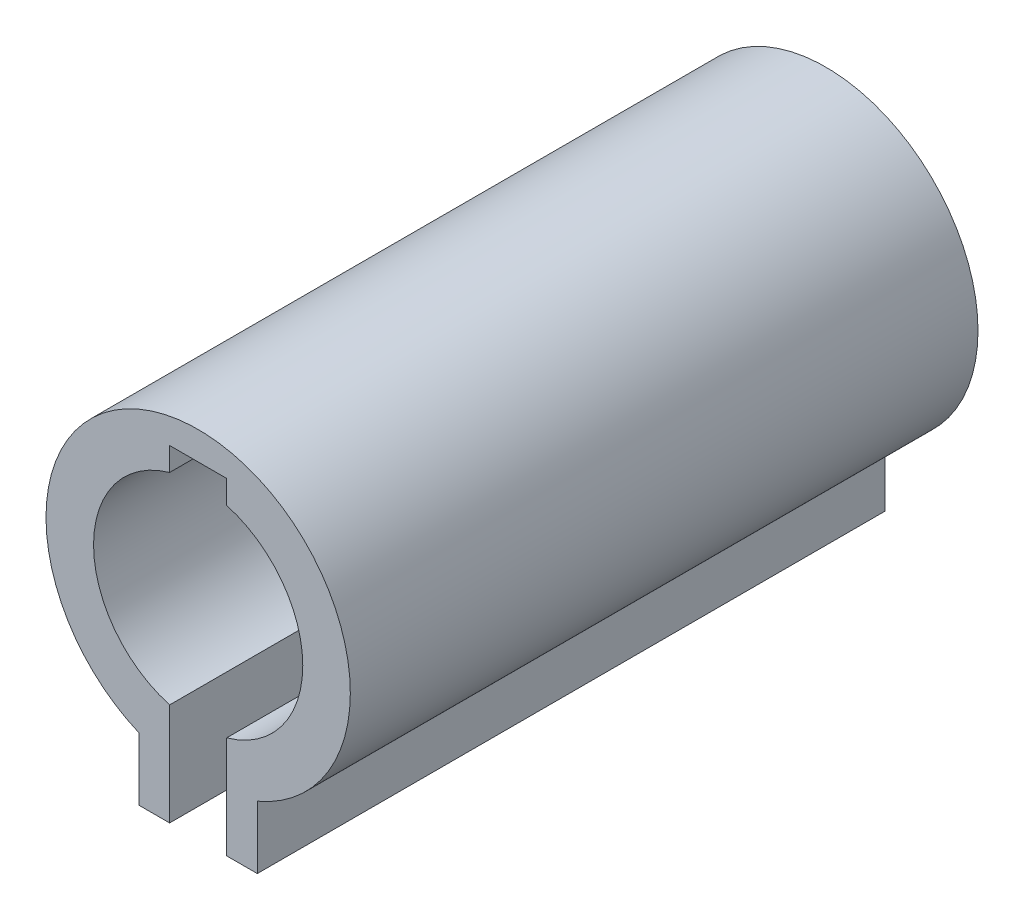
ISO-10303-21;
HEADER;
FILE_DESCRIPTION(('STEP AP214'),'2;1');
FILE_NAME('part.step','',(''),(''),'','','');
FILE_SCHEMA(('AUTOMOTIVE_DESIGN { 1 0 10303 214 1 1 1 1 }'));
ENDSEC;
DATA;
#1=APPLICATION_CONTEXT('core data for automotive mechanical design processes');
#2=APPLICATION_PROTOCOL_DEFINITION('international standard','automotive_design',2000,#1);
#3=PRODUCT_CONTEXT('',#1,'mechanical');
#4=PRODUCT('Part','Part','',(#3));
#5=PRODUCT_RELATED_PRODUCT_CATEGORY('part','',(#4));
#6=PRODUCT_DEFINITION_FORMATION('','',#4);
#7=PRODUCT_DEFINITION_CONTEXT('part definition',#1,'design');
#8=PRODUCT_DEFINITION('design','',#6,#7);
#9=PRODUCT_DEFINITION_SHAPE('','',#8);
#10=(LENGTH_UNIT() NAMED_UNIT(*) SI_UNIT(.MILLI.,.METRE.));
#11=(NAMED_UNIT(*) PLANE_ANGLE_UNIT() SI_UNIT($,.RADIAN.));
#12=(NAMED_UNIT(*) SI_UNIT($,.STERADIAN.) SOLID_ANGLE_UNIT());
#13=UNCERTAINTY_MEASURE_WITH_UNIT(LENGTH_MEASURE(1.E-05),#10,'distance_accuracy_value','');
#14=(GEOMETRIC_REPRESENTATION_CONTEXT(3) GLOBAL_UNCERTAINTY_ASSIGNED_CONTEXT((#13)) GLOBAL_UNIT_ASSIGNED_CONTEXT((#10,
#11,#12)) REPRESENTATION_CONTEXT('',''));
#15=CARTESIAN_POINT('',(0.,0.,0.));
#16=DIRECTION('',(0.,0.,1.));
#17=DIRECTION('',(1.,0.,0.));
#18=AXIS2_PLACEMENT_3D('',#15,#16,#17);
#19=CARTESIAN_POINT('',(0.,0.,-33.));
#20=DIRECTION('',(0.,0.,1.));
#21=DIRECTION('',(1.,0.,0.));
#22=AXIS2_PLACEMENT_3D('',#19,#20,#21);
#23=CYLINDRICAL_SURFACE('',#22,11.);
#24=CARTESIAN_POINT('',(0.,0.,33.));
#25=DIRECTION('',(0.,0.,1.));
#26=DIRECTION('',(1.,0.,0.));
#27=AXIS2_PLACEMENT_3D('',#24,#25,#26);
#28=CIRCLE('',#27,11.);
#29=CARTESIAN_POINT('',(-3.,10.5830052442584,33.));
#30=VERTEX_POINT('',#29);
#31=CARTESIAN_POINT('',(-3.,-10.5830052442584,33.));
#32=VERTEX_POINT('',#31);
#33=EDGE_CURVE('E167',#30,#32,#28,.T.);
#34=ORIENTED_EDGE('',*,*,#33,.T.);
#35=DIRECTION('',(0.,0.,1.));
#36=VECTOR('',#35,1.);
#37=CARTESIAN_POINT('',(-3.,-10.5830052442584,-33.));
#38=LINE('',#37,#36);
#39=CARTESIAN_POINT('',(-3.,-10.5830052442584,-33.));
#40=VERTEX_POINT('',#39);
#41=EDGE_CURVE('E155',#40,#32,#38,.T.);
#42=ORIENTED_EDGE('',*,*,#41,.F.);
#43=CARTESIAN_POINT('',(0.,0.,-33.));
#44=DIRECTION('',(0.,0.,1.));
#45=DIRECTION('',(1.,0.,0.));
#46=AXIS2_PLACEMENT_3D('',#43,#44,#45);
#47=CIRCLE('',#46,11.);
#48=CARTESIAN_POINT('',(-3.,10.5830052442584,-33.));
#49=VERTEX_POINT('',#48);
#50=EDGE_CURVE('E162',#49,#40,#47,.T.);
#51=ORIENTED_EDGE('',*,*,#50,.F.);
#52=DIRECTION('',(0.,0.,1.));
#53=VECTOR('',#52,1.);
#54=CARTESIAN_POINT('',(-3.,10.5830052442584,-33.));
#55=LINE('',#54,#53);
#56=EDGE_CURVE('E233',#49,#30,#55,.T.);
#57=ORIENTED_EDGE('',*,*,#56,.T.);
#58=EDGE_LOOP('',(#34,#42,#51,#57));
#59=FACE_BOUND('',#58,.T.);
#60=ADVANCED_FACE('F41',(#59),#23,.F.);
#61=CARTESIAN_POINT('',(0.,0.,-33.));
#62=DIRECTION('',(0.,0.,1.));
#63=DIRECTION('',(1.,0.,0.));
#64=AXIS2_PLACEMENT_3D('',#61,#62,#63);
#65=CYLINDRICAL_SURFACE('',#64,16.);
#66=DIRECTION('',(0.,0.,1.));
#67=VECTOR('',#66,1.);
#68=CARTESIAN_POINT('',(6.21844103807771,-14.7421501503665,-33.));
#69=LINE('',#68,#67);
#70=CARTESIAN_POINT('',(6.21844103807771,-14.7421501503665,-33.));
#71=VERTEX_POINT('',#70);
#72=CARTESIAN_POINT('',(6.21844103807771,-14.7421501503665,33.));
#73=VERTEX_POINT('',#72);
#74=EDGE_CURVE('E179',#71,#73,#69,.T.);
#75=ORIENTED_EDGE('',*,*,#74,.F.);
#76=CARTESIAN_POINT('',(0.,0.,-33.));
#77=DIRECTION('',(0.,0.,1.));
#78=DIRECTION('',(1.,0.,0.));
#79=AXIS2_PLACEMENT_3D('',#76,#77,#78);
#80=CIRCLE('',#79,16.);
#81=CARTESIAN_POINT('',(-6.21844103807771,-14.7421501503665,-33.));
#82=VERTEX_POINT('',#81);
#83=EDGE_CURVE('E50',#71,#82,#80,.T.);
#84=ORIENTED_EDGE('',*,*,#83,.T.);
#85=DIRECTION('',(0.,0.,1.));
#86=VECTOR('',#85,1.);
#87=CARTESIAN_POINT('',(-6.21844103807771,-14.7421501503665,-33.));
#88=LINE('',#87,#86);
#89=CARTESIAN_POINT('',(-6.21844103807771,-14.7421501503665,33.));
#90=VERTEX_POINT('',#89);
#91=EDGE_CURVE('E178',#82,#90,#88,.T.);
#92=ORIENTED_EDGE('',*,*,#91,.T.);
#93=CARTESIAN_POINT('',(0.,0.,33.));
#94=DIRECTION('',(0.,0.,1.));
#95=DIRECTION('',(1.,0.,0.));
#96=AXIS2_PLACEMENT_3D('',#93,#94,#95);
#97=CIRCLE('',#96,16.);
#98=EDGE_CURVE('E163',#73,#90,#97,.T.);
#99=ORIENTED_EDGE('',*,*,#98,.F.);
#100=EDGE_LOOP('',(#75,#84,#92,#99));
#101=FACE_BOUND('',#100,.T.);
#102=ADVANCED_FACE('F43',(#101),#65,.T.);
#103=CARTESIAN_POINT('',(0.,0.,-33.));
#104=DIRECTION('',(0.,0.,1.));
#105=DIRECTION('',(1.,0.,0.));
#106=AXIS2_PLACEMENT_3D('',#103,#104,#105);
#107=PLANE('',#106);
#108=ORIENTED_EDGE('',*,*,#50,.T.);
#109=DIRECTION('',(0.,-1.,0.));
#110=VECTOR('',#109,1.);
#111=CARTESIAN_POINT('',(-3.,0.,-33.));
#112=LINE('',#111,#110);
#113=CARTESIAN_POINT('',(-3.,-21.3356856306457,-33.));
#114=VERTEX_POINT('',#113);
#115=EDGE_CURVE('E209',#40,#114,#112,.T.);
#116=ORIENTED_EDGE('',*,*,#115,.T.);
#117=DIRECTION('',(-1.,0.,0.));
#118=VECTOR('',#117,1.);
#119=CARTESIAN_POINT('',(0.,-21.3356856306457,-33.));
#120=LINE('',#119,#118);
#121=CARTESIAN_POINT('',(-6.21844103807771,-21.3356856306457,-33.));
#122=VERTEX_POINT('',#121);
#123=EDGE_CURVE('E183',#114,#122,#120,.T.);
#124=ORIENTED_EDGE('',*,*,#123,.T.);
#125=DIRECTION('',(0.,1.,0.));
#126=VECTOR('',#125,1.);
#127=CARTESIAN_POINT('',(-6.21844103807771,0.,-33.));
#128=LINE('',#127,#126);
#129=EDGE_CURVE('E181',#122,#82,#128,.T.);
#130=ORIENTED_EDGE('',*,*,#129,.T.);
#131=ORIENTED_EDGE('',*,*,#83,.F.);
#132=DIRECTION('',(0.,1.,0.));
#133=VECTOR('',#132,1.);
#134=CARTESIAN_POINT('',(6.21844103807771,0.,-33.));
#135=LINE('',#134,#133);
#136=CARTESIAN_POINT('',(6.21844103807771,-21.3356856306457,-33.));
#137=VERTEX_POINT('',#136);
#138=EDGE_CURVE('E146',#137,#71,#135,.T.);
#139=ORIENTED_EDGE('',*,*,#138,.F.);
#140=DIRECTION('',(1.,0.,0.));
#141=VECTOR('',#140,1.);
#142=CARTESIAN_POINT('',(0.,-21.3356856306457,-33.));
#143=LINE('',#142,#141);
#144=CARTESIAN_POINT('',(3.,-21.3356856306457,-33.));
#145=VERTEX_POINT('',#144);
#146=EDGE_CURVE('E140',#145,#137,#143,.T.);
#147=ORIENTED_EDGE('',*,*,#146,.F.);
#148=DIRECTION('',(0.,-1.,0.));
#149=VECTOR('',#148,1.);
#150=CARTESIAN_POINT('',(3.,0.,-33.));
#151=LINE('',#150,#149);
#152=CARTESIAN_POINT('',(3.,-10.5830052442584,-33.));
#153=VERTEX_POINT('',#152);
#154=EDGE_CURVE('E130',#153,#145,#151,.T.);
#155=ORIENTED_EDGE('',*,*,#154,.F.);
#156=CARTESIAN_POINT('',(3.,10.5830052442584,-33.));
#157=VERTEX_POINT('',#156);
#158=EDGE_CURVE('E136',#153,#157,#47,.T.);
#159=ORIENTED_EDGE('',*,*,#158,.T.);
#160=DIRECTION('',(0.,1.,0.));
#161=VECTOR('',#160,1.);
#162=CARTESIAN_POINT('',(3.,13.0401957127915,-33.));
#163=LINE('',#162,#161);
#164=CARTESIAN_POINT('',(3.,13.0401957127915,-33.));
#165=VERTEX_POINT('',#164);
#166=EDGE_CURVE('E214',#157,#165,#163,.T.);
#167=ORIENTED_EDGE('',*,*,#166,.T.);
#168=DIRECTION('',(-1.,0.,0.));
#169=VECTOR('',#168,1.);
#170=CARTESIAN_POINT('',(0.,13.0401957127915,-33.));
#171=LINE('',#170,#169);
#172=CARTESIAN_POINT('',(-3.,13.0401957127915,-33.));
#173=VERTEX_POINT('',#172);
#174=EDGE_CURVE('E200',#165,#173,#171,.T.);
#175=ORIENTED_EDGE('',*,*,#174,.T.);
#176=DIRECTION('',(0.,-1.,0.));
#177=VECTOR('',#176,1.);
#178=CARTESIAN_POINT('',(-3.,10.5401957127915,-33.));
#179=LINE('',#178,#177);
#180=EDGE_CURVE('E194',#173,#49,#179,.T.);
#181=ORIENTED_EDGE('',*,*,#180,.T.);
#182=EDGE_LOOP('',(#108,#116,#124,#130,#131,#139,#147,#155,#159,#167,#175,#181));
#183=FACE_BOUND('',#182,.T.);
#184=ADVANCED_FACE('F133',(#183),#107,.F.);
#185=ORIENTED_EDGE('',*,*,#158,.F.);
#186=DIRECTION('',(0.,0.,1.));
#187=VECTOR('',#186,1.);
#188=CARTESIAN_POINT('',(3.,-10.5830052442584,-33.));
#189=LINE('',#188,#187);
#190=CARTESIAN_POINT('',(3.,-10.5830052442584,33.));
#191=VERTEX_POINT('',#190);
#192=EDGE_CURVE('E149',#153,#191,#189,.T.);
#193=ORIENTED_EDGE('',*,*,#192,.T.);
#194=CARTESIAN_POINT('',(3.,10.5830052442584,33.));
#195=VERTEX_POINT('',#194);
#196=EDGE_CURVE('E236',#191,#195,#28,.T.);
#197=ORIENTED_EDGE('',*,*,#196,.T.);
#198=DIRECTION('',(0.,0.,1.));
#199=VECTOR('',#198,1.);
#200=CARTESIAN_POINT('',(3.,10.5830052442584,-33.));
#201=LINE('',#200,#199);
#202=EDGE_CURVE('E159',#195,#157,#201,.F.);
#203=ORIENTED_EDGE('',*,*,#202,.T.);
#204=EDGE_LOOP('',(#185,#193,#197,#203));
#205=FACE_BOUND('',#204,.T.);
#206=ADVANCED_FACE('F157',(#205),#23,.F.);
#207=CARTESIAN_POINT('',(0.,0.,33.));
#208=DIRECTION('',(0.,0.,1.));
#209=DIRECTION('',(1.,0.,0.));
#210=AXIS2_PLACEMENT_3D('',#207,#208,#209);
#211=PLANE('',#210);
#212=DIRECTION('',(0.,-1.,0.));
#213=VECTOR('',#212,1.);
#214=CARTESIAN_POINT('',(-3.,0.,33.));
#215=LINE('',#214,#213);
#216=CARTESIAN_POINT('',(-3.,-21.3356856306457,33.));
#217=VERTEX_POINT('',#216);
#218=EDGE_CURVE('E57',#32,#217,#215,.T.);
#219=ORIENTED_EDGE('',*,*,#218,.F.);
#220=ORIENTED_EDGE('',*,*,#33,.F.);
#221=DIRECTION('',(0.,-1.,0.));
#222=VECTOR('',#221,1.);
#223=CARTESIAN_POINT('',(-3.,10.5401957127915,33.));
#224=LINE('',#223,#222);
#225=CARTESIAN_POINT('',(-3.,13.0401957127915,33.));
#226=VERTEX_POINT('',#225);
#227=EDGE_CURVE('E221',#226,#30,#224,.T.);
#228=ORIENTED_EDGE('',*,*,#227,.F.);
#229=DIRECTION('',(-1.,0.,0.));
#230=VECTOR('',#229,1.);
#231=CARTESIAN_POINT('',(-3.,13.0401957127915,33.));
#232=LINE('',#231,#230);
#233=CARTESIAN_POINT('',(3.,13.0401957127915,33.));
#234=VERTEX_POINT('',#233);
#235=EDGE_CURVE('E217',#234,#226,#232,.T.);
#236=ORIENTED_EDGE('',*,*,#235,.F.);
#237=DIRECTION('',(0.,1.,0.));
#238=VECTOR('',#237,1.);
#239=CARTESIAN_POINT('',(3.,0.,33.));
#240=LINE('',#239,#238);
#241=EDGE_CURVE('E11',#195,#234,#240,.T.);
#242=ORIENTED_EDGE('',*,*,#241,.F.);
#243=ORIENTED_EDGE('',*,*,#196,.F.);
#244=DIRECTION('',(0.,-1.,0.));
#245=VECTOR('',#244,1.);
#246=CARTESIAN_POINT('',(3.,0.,33.));
#247=LINE('',#246,#245);
#248=CARTESIAN_POINT('',(3.,-21.3356856306457,33.));
#249=VERTEX_POINT('',#248);
#250=EDGE_CURVE('E151',#191,#249,#247,.T.);
#251=ORIENTED_EDGE('',*,*,#250,.T.);
#252=DIRECTION('',(1.,0.,0.));
#253=VECTOR('',#252,1.);
#254=CARTESIAN_POINT('',(0.,-21.3356856306457,33.));
#255=LINE('',#254,#253);
#256=CARTESIAN_POINT('',(6.21844103807771,-21.3356856306457,33.));
#257=VERTEX_POINT('',#256);
#258=EDGE_CURVE('E256',#249,#257,#255,.T.);
#259=ORIENTED_EDGE('',*,*,#258,.T.);
#260=DIRECTION('',(0.,1.,0.));
#261=VECTOR('',#260,1.);
#262=CARTESIAN_POINT('',(6.21844103807771,0.,33.));
#263=LINE('',#262,#261);
#264=EDGE_CURVE('E64',#257,#73,#263,.T.);
#265=ORIENTED_EDGE('',*,*,#264,.T.);
#266=ORIENTED_EDGE('',*,*,#98,.T.);
#267=DIRECTION('',(0.,1.,0.));
#268=VECTOR('',#267,1.);
#269=CARTESIAN_POINT('',(-6.21844103807771,0.,33.));
#270=LINE('',#269,#268);
#271=CARTESIAN_POINT('',(-6.21844103807771,-21.3356856306457,33.));
#272=VERTEX_POINT('',#271);
#273=EDGE_CURVE('E192',#272,#90,#270,.T.);
#274=ORIENTED_EDGE('',*,*,#273,.F.);
#275=DIRECTION('',(-1.,0.,0.));
#276=VECTOR('',#275,1.);
#277=CARTESIAN_POINT('',(0.,-21.3356856306457,33.));
#278=LINE('',#277,#276);
#279=EDGE_CURVE('E281',#217,#272,#278,.T.);
#280=ORIENTED_EDGE('',*,*,#279,.F.);
#281=EDGE_LOOP('',(#219,#220,#228,#236,#242,#243,#251,#259,#265,#266,#274,#280));
#282=FACE_BOUND('',#281,.T.);
#283=ADVANCED_FACE('F246',(#282),#211,.T.);
#284=CARTESIAN_POINT('',(-3.,10.5401957127915,0.));
#285=DIRECTION('',(-1.,0.,0.));
#286=DIRECTION('',(0.,0.,1.));
#287=AXIS2_PLACEMENT_3D('',#284,#285,#286);
#288=PLANE('',#287);
#289=ORIENTED_EDGE('',*,*,#56,.F.);
#290=ORIENTED_EDGE('',*,*,#180,.F.);
#291=DIRECTION('',(0.,0.,1.));
#292=VECTOR('',#291,1.);
#293=CARTESIAN_POINT('',(-3.,13.0401957127915,0.));
#294=LINE('',#293,#292);
#295=EDGE_CURVE('E225',#173,#226,#294,.T.);
#296=ORIENTED_EDGE('',*,*,#295,.T.);
#297=ORIENTED_EDGE('',*,*,#227,.T.);
#298=EDGE_LOOP('',(#289,#290,#296,#297));
#299=FACE_BOUND('',#298,.T.);
#300=ADVANCED_FACE('F310',(#299),#288,.F.);
#301=CARTESIAN_POINT('',(3.,13.0401957127915,0.));
#302=DIRECTION('',(1.,0.,0.));
#303=DIRECTION('',(0.,0.,-1.));
#304=AXIS2_PLACEMENT_3D('',#301,#302,#303);
#305=PLANE('',#304);
#306=ORIENTED_EDGE('',*,*,#241,.T.);
#307=DIRECTION('',(0.,0.,1.));
#308=VECTOR('',#307,1.);
#309=CARTESIAN_POINT('',(3.,13.0401957127915,0.));
#310=LINE('',#309,#308);
#311=EDGE_CURVE('E224',#165,#234,#310,.T.);
#312=ORIENTED_EDGE('',*,*,#311,.F.);
#313=ORIENTED_EDGE('',*,*,#166,.F.);
#314=ORIENTED_EDGE('',*,*,#202,.F.);
#315=EDGE_LOOP('',(#306,#312,#313,#314));
#316=FACE_BOUND('',#315,.T.);
#317=ADVANCED_FACE('F244',(#316),#305,.F.);
#318=CARTESIAN_POINT('',(-3.,13.0401957127915,0.));
#319=DIRECTION('',(0.,1.,0.));
#320=DIRECTION('',(0.,0.,1.));
#321=AXIS2_PLACEMENT_3D('',#318,#319,#320);
#322=PLANE('',#321);
#323=ORIENTED_EDGE('',*,*,#235,.T.);
#324=ORIENTED_EDGE('',*,*,#295,.F.);
#325=ORIENTED_EDGE('',*,*,#174,.F.);
#326=ORIENTED_EDGE('',*,*,#311,.T.);
#327=EDGE_LOOP('',(#323,#324,#325,#326));
#328=FACE_BOUND('',#327,.T.);
#329=ADVANCED_FACE('F249',(#328),#322,.F.);
#330=CARTESIAN_POINT('',(-6.21844103807771,0.,-33.));
#331=DIRECTION('',(1.,0.,0.));
#332=DIRECTION('',(0.,0.,-1.));
#333=AXIS2_PLACEMENT_3D('',#330,#331,#332);
#334=PLANE('',#333);
#335=ORIENTED_EDGE('',*,*,#273,.T.);
#336=ORIENTED_EDGE('',*,*,#91,.F.);
#337=ORIENTED_EDGE('',*,*,#129,.F.);
#338=DIRECTION('',(0.,0.,1.));
#339=VECTOR('',#338,1.);
#340=CARTESIAN_POINT('',(-6.21844103807771,-21.3356856306457,-33.));
#341=LINE('',#340,#339);
#342=EDGE_CURVE('E203',#122,#272,#341,.T.);
#343=ORIENTED_EDGE('',*,*,#342,.T.);
#344=EDGE_LOOP('',(#335,#336,#337,#343));
#345=FACE_BOUND('',#344,.T.);
#346=ADVANCED_FACE('F190',(#345),#334,.F.);
#347=CARTESIAN_POINT('',(-3.,0.,-33.));
#348=DIRECTION('',(-1.,0.,0.));
#349=DIRECTION('',(0.,0.,1.));
#350=AXIS2_PLACEMENT_3D('',#347,#348,#349);
#351=PLANE('',#350);
#352=DIRECTION('',(0.,0.,1.));
#353=VECTOR('',#352,1.);
#354=CARTESIAN_POINT('',(-3.,-21.3356856306457,-33.));
#355=LINE('',#354,#353);
#356=EDGE_CURVE('E195',#114,#217,#355,.T.);
#357=ORIENTED_EDGE('',*,*,#356,.F.);
#358=ORIENTED_EDGE('',*,*,#115,.F.);
#359=ORIENTED_EDGE('',*,*,#41,.T.);
#360=ORIENTED_EDGE('',*,*,#218,.T.);
#361=EDGE_LOOP('',(#357,#358,#359,#360));
#362=FACE_BOUND('',#361,.T.);
#363=ADVANCED_FACE('F286',(#362),#351,.F.);
#364=CARTESIAN_POINT('',(0.,-21.3356856306457,-33.));
#365=DIRECTION('',(0.,1.,0.));
#366=DIRECTION('',(0.,0.,1.));
#367=AXIS2_PLACEMENT_3D('',#364,#365,#366);
#368=PLANE('',#367);
#369=ORIENTED_EDGE('',*,*,#279,.T.);
#370=ORIENTED_EDGE('',*,*,#342,.F.);
#371=ORIENTED_EDGE('',*,*,#123,.F.);
#372=ORIENTED_EDGE('',*,*,#356,.T.);
#373=EDGE_LOOP('',(#369,#370,#371,#372));
#374=FACE_BOUND('',#373,.T.);
#375=ADVANCED_FACE('F287',(#374),#368,.F.);
#376=CARTESIAN_POINT('',(0.,-21.3356856306457,-33.));
#377=DIRECTION('',(0.,-1.,0.));
#378=DIRECTION('',(0.,0.,-1.));
#379=AXIS2_PLACEMENT_3D('',#376,#377,#378);
#380=PLANE('',#379);
#381=ORIENTED_EDGE('',*,*,#258,.F.);
#382=DIRECTION('',(0.,0.,1.));
#383=VECTOR('',#382,1.);
#384=CARTESIAN_POINT('',(3.,-21.3356856306457,-33.));
#385=LINE('',#384,#383);
#386=EDGE_CURVE('E269',#145,#249,#385,.T.);
#387=ORIENTED_EDGE('',*,*,#386,.F.);
#388=ORIENTED_EDGE('',*,*,#146,.T.);
#389=DIRECTION('',(0.,0.,1.));
#390=VECTOR('',#389,1.);
#391=CARTESIAN_POINT('',(6.21844103807771,-21.3356856306457,-33.));
#392=LINE('',#391,#390);
#393=EDGE_CURVE('E145',#137,#257,#392,.T.);
#394=ORIENTED_EDGE('',*,*,#393,.T.);
#395=EDGE_LOOP('',(#381,#387,#388,#394));
#396=FACE_BOUND('',#395,.T.);
#397=ADVANCED_FACE('F289',(#396),#380,.T.);
#398=CARTESIAN_POINT('',(3.,0.,-33.));
#399=DIRECTION('',(-1.,0.,0.));
#400=DIRECTION('',(0.,-1.,0.));
#401=AXIS2_PLACEMENT_3D('',#398,#399,#400);
#402=PLANE('',#401);
#403=ORIENTED_EDGE('',*,*,#386,.T.);
#404=ORIENTED_EDGE('',*,*,#250,.F.);
#405=ORIENTED_EDGE('',*,*,#192,.F.);
#406=ORIENTED_EDGE('',*,*,#154,.T.);
#407=EDGE_LOOP('',(#403,#404,#405,#406));
#408=FACE_BOUND('',#407,.T.);
#409=ADVANCED_FACE('F150',(#408),#402,.T.);
#410=CARTESIAN_POINT('',(6.21844103807771,0.,-33.));
#411=DIRECTION('',(1.,0.,0.));
#412=DIRECTION('',(0.,0.,-1.));
#413=AXIS2_PLACEMENT_3D('',#410,#411,#412);
#414=PLANE('',#413);
#415=ORIENTED_EDGE('',*,*,#264,.F.);
#416=ORIENTED_EDGE('',*,*,#393,.F.);
#417=ORIENTED_EDGE('',*,*,#138,.T.);
#418=ORIENTED_EDGE('',*,*,#74,.T.);
#419=EDGE_LOOP('',(#415,#416,#417,#418));
#420=FACE_BOUND('',#419,.T.);
#421=ADVANCED_FACE('F349',(#420),#414,.T.);
#422=CLOSED_SHELL('',(#60,#102,#184,#206,#283,#300,#317,#329,#346,#363,#375,#397,#409,#421));
#423=MANIFOLD_SOLID_BREP('B2',#422);
#424=ADVANCED_BREP_SHAPE_REPRESENTATION('',(#18,#423),#14);
#425=SHAPE_DEFINITION_REPRESENTATION(#9,#424);
ENDSEC;
END-ISO-10303-21;
